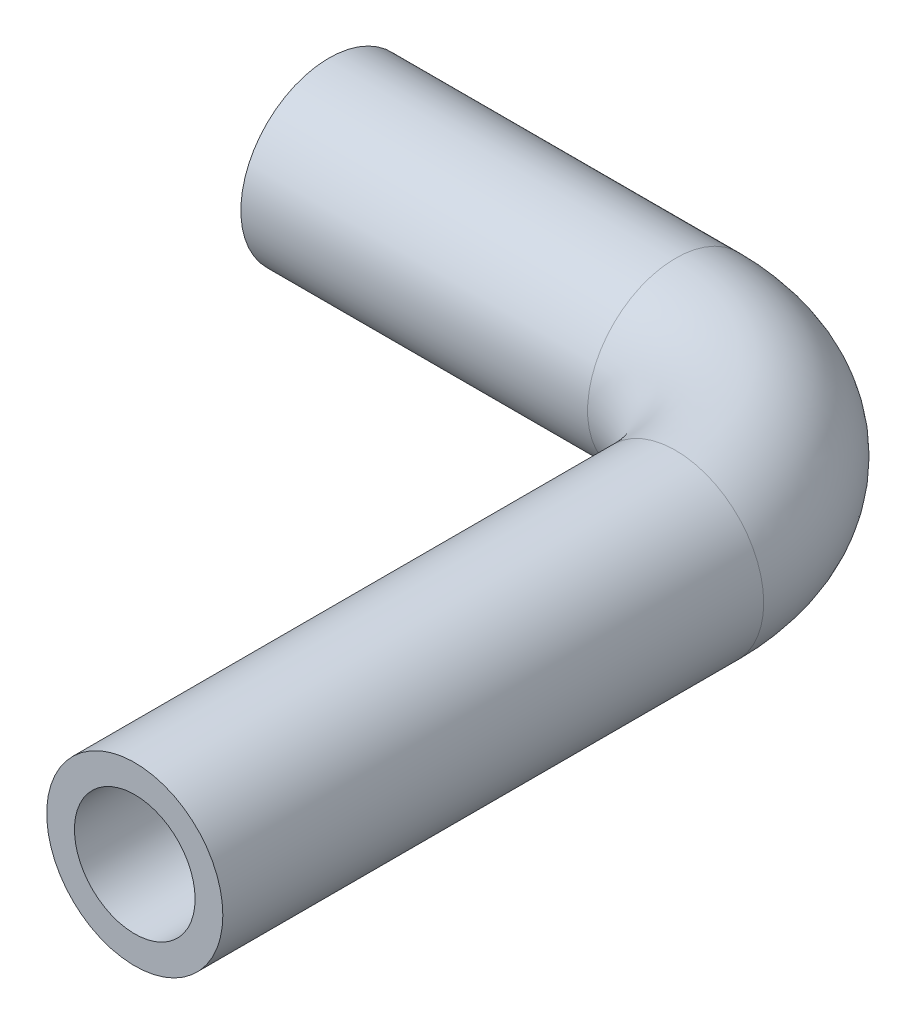
ISO-10303-21;
HEADER;
FILE_DESCRIPTION(('STEP AP214'),'2;1');
FILE_NAME('part.step','',(''),(''),'','','');
FILE_SCHEMA(('AUTOMOTIVE_DESIGN { 1 0 10303 214 1 1 1 1 }'));
ENDSEC;
DATA;
#1=APPLICATION_CONTEXT('core data for automotive mechanical design processes');
#2=APPLICATION_PROTOCOL_DEFINITION('international standard','automotive_design',2000,#1);
#3=PRODUCT_CONTEXT('',#1,'mechanical');
#4=PRODUCT('Part','Part','',(#3));
#5=PRODUCT_RELATED_PRODUCT_CATEGORY('part','',(#4));
#6=PRODUCT_DEFINITION_FORMATION('','',#4);
#7=PRODUCT_DEFINITION_CONTEXT('part definition',#1,'design');
#8=PRODUCT_DEFINITION('design','',#6,#7);
#9=PRODUCT_DEFINITION_SHAPE('','',#8);
#10=(LENGTH_UNIT() NAMED_UNIT(*) SI_UNIT(.MILLI.,.METRE.));
#11=(NAMED_UNIT(*) PLANE_ANGLE_UNIT() SI_UNIT($,.RADIAN.));
#12=(NAMED_UNIT(*) SI_UNIT($,.STERADIAN.) SOLID_ANGLE_UNIT());
#13=UNCERTAINTY_MEASURE_WITH_UNIT(LENGTH_MEASURE(1.E-05),#10,'distance_accuracy_value','');
#14=(GEOMETRIC_REPRESENTATION_CONTEXT(3) GLOBAL_UNCERTAINTY_ASSIGNED_CONTEXT((#13)) GLOBAL_UNIT_ASSIGNED_CONTEXT((#10,
#11,#12)) REPRESENTATION_CONTEXT('',''));
#15=CARTESIAN_POINT('',(0.,0.,0.));
#16=DIRECTION('',(0.,0.,1.));
#17=DIRECTION('',(1.,0.,0.));
#18=AXIS2_PLACEMENT_3D('',#15,#16,#17);
#19=CARTESIAN_POINT('',(182.,326.,175.5));
#20=DIRECTION('',(0.,0.,1.));
#21=DIRECTION('',(1.,0.,0.));
#22=AXIS2_PLACEMENT_3D('',#19,#20,#21);
#23=PLANE('',#22);
#24=CARTESIAN_POINT('',(182.,326.,175.5));
#25=DIRECTION('',(0.,0.,1.));
#26=DIRECTION('',(1.,0.,0.));
#27=AXIS2_PLACEMENT_3D('',#24,#25,#26);
#28=CIRCLE('',#27,2.17500000000001);
#29=CARTESIAN_POINT('',(184.175,326.,175.5));
#30=VERTEX_POINT('',#29);
#31=EDGE_CURVE('E88',#30,#30,#28,.T.);
#32=ORIENTED_EDGE('',*,*,#31,.F.);
#33=EDGE_LOOP('',(#32));
#34=FACE_BOUND('',#33,.T.);
#35=CARTESIAN_POINT('',(182.,326.,175.5));
#36=DIRECTION('',(0.,0.,1.));
#37=DIRECTION('',(1.,0.,0.));
#38=AXIS2_PLACEMENT_3D('',#35,#36,#37);
#39=CIRCLE('',#38,3.17500000000001);
#40=CARTESIAN_POINT('',(185.175,326.,175.5));
#41=VERTEX_POINT('',#40);
#42=EDGE_CURVE('E68',#41,#41,#39,.T.);
#43=ORIENTED_EDGE('',*,*,#42,.T.);
#44=EDGE_LOOP('',(#43));
#45=FACE_BOUND('',#44,.T.);
#46=ADVANCED_FACE('F52',(#34,#45),#23,.T.);
#47=CARTESIAN_POINT('',(163.5,326.,150.));
#48=DIRECTION('',(1.,0.,0.));
#49=DIRECTION('',(0.,0.,-1.));
#50=AXIS2_PLACEMENT_3D('',#47,#48,#49);
#51=PLANE('',#50);
#52=CARTESIAN_POINT('',(163.5,326.,150.));
#53=DIRECTION('',(1.,0.,0.));
#54=DIRECTION('',(0.,0.,-1.));
#55=AXIS2_PLACEMENT_3D('',#52,#53,#54);
#56=CIRCLE('',#55,2.17500000000001);
#57=CARTESIAN_POINT('',(163.5,326.,147.825));
#58=VERTEX_POINT('',#57);
#59=EDGE_CURVE('E71',#58,#58,#56,.T.);
#60=ORIENTED_EDGE('',*,*,#59,.T.);
#61=EDGE_LOOP('',(#60));
#62=FACE_BOUND('',#61,.T.);
#63=CARTESIAN_POINT('',(163.5,326.,150.));
#64=DIRECTION('',(1.,0.,0.));
#65=DIRECTION('',(0.,0.,-1.));
#66=AXIS2_PLACEMENT_3D('',#63,#64,#65);
#67=CIRCLE('',#66,3.17500000000001);
#68=CARTESIAN_POINT('',(163.5,326.,146.825));
#69=VERTEX_POINT('',#68);
#70=EDGE_CURVE('E11',#69,#69,#67,.T.);
#71=ORIENTED_EDGE('',*,*,#70,.F.);
#72=EDGE_LOOP('',(#71));
#73=FACE_BOUND('',#72,.T.);
#74=ADVANCED_FACE('F91',(#62,#73),#51,.F.);
#75=CARTESIAN_POINT('',(182.,326.,175.5));
#76=DIRECTION('',(0.,0.,-1.));
#77=DIRECTION('',(-1.,0.,0.));
#78=AXIS2_PLACEMENT_3D('',#75,#76,#77);
#79=CYLINDRICAL_SURFACE('',#78,3.17500000000001);
#80=CARTESIAN_POINT('',(182.,326.,156.));
#81=DIRECTION('',(0.,0.,-1.));
#82=DIRECTION('',(-1.,0.,0.));
#83=AXIS2_PLACEMENT_3D('',#80,#81,#82);
#84=CIRCLE('',#83,3.17500000000001);
#85=CARTESIAN_POINT('',(185.175,326.,156.));
#86=VERTEX_POINT('',#85);
#87=EDGE_CURVE('E63',#86,#86,#84,.F.);
#88=ORIENTED_EDGE('',*,*,#87,.T.);
#89=EDGE_LOOP('',(#88));
#90=FACE_BOUND('',#89,.T.);
#91=ORIENTED_EDGE('',*,*,#42,.F.);
#92=EDGE_LOOP('',(#91));
#93=FACE_BOUND('',#92,.T.);
#94=ADVANCED_FACE('F97',(#90,#93),#79,.T.);
#95=CARTESIAN_POINT('',(176.,326.,156.));
#96=DIRECTION('',(0.,1.,0.));
#97=DIRECTION('',(0.,0.,1.));
#98=AXIS2_PLACEMENT_3D('',#95,#96,#97);
#99=TOROIDAL_SURFACE('',#98,6.00000000000001,3.17500000000001);
#100=CARTESIAN_POINT('',(176.,326.,150.));
#101=DIRECTION('',(1.,0.,0.));
#102=DIRECTION('',(0.,0.,-1.));
#103=AXIS2_PLACEMENT_3D('',#100,#101,#102);
#104=CIRCLE('',#103,3.17500000000001);
#105=CARTESIAN_POINT('',(176.,326.,146.825));
#106=VERTEX_POINT('',#105);
#107=EDGE_CURVE('E58',#106,#106,#104,.T.);
#108=CARTESIAN_POINT('',(176.,326.,156.));
#109=DIRECTION('',(0.,1.,0.));
#110=DIRECTION('',(0.,0.,1.));
#111=AXIS2_PLACEMENT_3D('',#108,#109,#110);
#112=CIRCLE('',#111,9.17500000000002);
#113=EDGE_CURVE('',#86,#106,#112,.T.);
#114=ORIENTED_EDGE('',*,*,#87,.F.);
#115=ORIENTED_EDGE('',*,*,#107,.T.);
#116=ORIENTED_EDGE('',*,*,#113,.T.);
#117=ORIENTED_EDGE('',*,*,#113,.F.);
#118=EDGE_LOOP('',(#114,#116,#115,#117));
#119=FACE_BOUND('',#118,.T.);
#120=ADVANCED_FACE('F110',(#119),#99,.T.);
#121=CARTESIAN_POINT('',(176.,326.,150.));
#122=DIRECTION('',(-1.,0.,0.));
#123=DIRECTION('',(0.,0.,1.));
#124=AXIS2_PLACEMENT_3D('',#121,#122,#123);
#125=CYLINDRICAL_SURFACE('',#124,3.17500000000001);
#126=ORIENTED_EDGE('',*,*,#70,.T.);
#127=EDGE_LOOP('',(#126));
#128=FACE_BOUND('',#127,.T.);
#129=ORIENTED_EDGE('',*,*,#107,.F.);
#130=EDGE_LOOP('',(#129));
#131=FACE_BOUND('',#130,.T.);
#132=ADVANCED_FACE('F54',(#128,#131),#125,.T.);
#133=CARTESIAN_POINT('',(182.,326.,175.5));
#134=DIRECTION('',(0.,0.,-1.));
#135=DIRECTION('',(-1.,0.,0.));
#136=AXIS2_PLACEMENT_3D('',#133,#134,#135);
#137=CYLINDRICAL_SURFACE('',#136,2.17500000000001);
#138=CARTESIAN_POINT('',(182.,326.,156.));
#139=DIRECTION('',(0.,0.,1.));
#140=DIRECTION('',(1.,0.,0.));
#141=AXIS2_PLACEMENT_3D('',#138,#139,#140);
#142=CIRCLE('',#141,2.17500000000001);
#143=CARTESIAN_POINT('',(184.175,326.,156.));
#144=VERTEX_POINT('',#143);
#145=EDGE_CURVE('E81',#144,#144,#142,.T.);
#146=ORIENTED_EDGE('',*,*,#145,.F.);
#147=EDGE_LOOP('',(#146));
#148=FACE_BOUND('',#147,.T.);
#149=ORIENTED_EDGE('',*,*,#31,.T.);
#150=EDGE_LOOP('',(#149));
#151=FACE_BOUND('',#150,.T.);
#152=ADVANCED_FACE('F89',(#148,#151),#137,.F.);
#153=CARTESIAN_POINT('',(176.,326.,156.));
#154=DIRECTION('',(0.,1.,0.));
#155=DIRECTION('',(0.,0.,1.));
#156=AXIS2_PLACEMENT_3D('',#153,#154,#155);
#157=TOROIDAL_SURFACE('',#156,6.00000000000001,2.17500000000001);
#158=CARTESIAN_POINT('',(176.,326.,150.));
#159=DIRECTION('',(1.,0.,0.));
#160=DIRECTION('',(0.,0.,-1.));
#161=AXIS2_PLACEMENT_3D('',#158,#159,#160);
#162=CIRCLE('',#161,2.17500000000001);
#163=CARTESIAN_POINT('',(176.,326.,147.825));
#164=VERTEX_POINT('',#163);
#165=EDGE_CURVE('E76',#164,#164,#162,.T.);
#166=CARTESIAN_POINT('',(176.,326.,156.));
#167=DIRECTION('',(0.,1.,0.));
#168=DIRECTION('',(0.,0.,1.));
#169=AXIS2_PLACEMENT_3D('',#166,#167,#168);
#170=CIRCLE('',#169,8.17500000000001);
#171=EDGE_CURVE('',#144,#164,#170,.T.);
#172=ORIENTED_EDGE('',*,*,#145,.T.);
#173=ORIENTED_EDGE('',*,*,#165,.F.);
#174=ORIENTED_EDGE('',*,*,#171,.T.);
#175=ORIENTED_EDGE('',*,*,#171,.F.);
#176=EDGE_LOOP('',(#172,#174,#173,#175));
#177=FACE_BOUND('',#176,.T.);
#178=ADVANCED_FACE('F103',(#177),#157,.F.);
#179=CARTESIAN_POINT('',(176.,326.,150.));
#180=DIRECTION('',(-1.,0.,0.));
#181=DIRECTION('',(0.,0.,1.));
#182=AXIS2_PLACEMENT_3D('',#179,#180,#181);
#183=CYLINDRICAL_SURFACE('',#182,2.17500000000001);
#184=ORIENTED_EDGE('',*,*,#59,.F.);
#185=EDGE_LOOP('',(#184));
#186=FACE_BOUND('',#185,.T.);
#187=ORIENTED_EDGE('',*,*,#165,.T.);
#188=EDGE_LOOP('',(#187));
#189=FACE_BOUND('',#188,.T.);
#190=ADVANCED_FACE('F92',(#186,#189),#183,.F.);
#191=CLOSED_SHELL('',(#46,#74,#94,#120,#132,#152,#178,#190));
#192=MANIFOLD_SOLID_BREP('B2',#191);
#193=ADVANCED_BREP_SHAPE_REPRESENTATION('',(#18,#192),#14);
#194=SHAPE_DEFINITION_REPRESENTATION(#9,#193);
ENDSEC;
END-ISO-10303-21;
